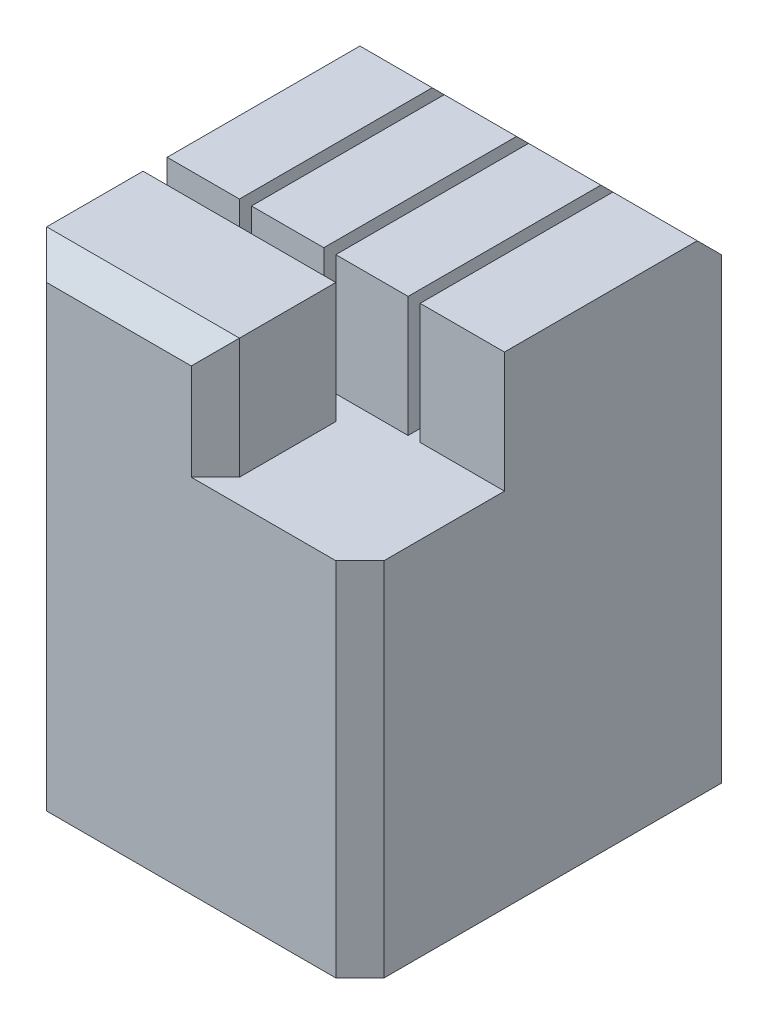
ISO-10303-21;
HEADER;
FILE_DESCRIPTION(('STEP AP214'),'2;1');
FILE_NAME('part.step','',(''),(''),'','','');
FILE_SCHEMA(('AUTOMOTIVE_DESIGN { 1 0 10303 214 1 1 1 1 }'));
ENDSEC;
DATA;
#1=APPLICATION_CONTEXT('core data for automotive mechanical design processes');
#2=APPLICATION_PROTOCOL_DEFINITION('international standard','automotive_design',2000,#1);
#3=PRODUCT_CONTEXT('',#1,'mechanical');
#4=PRODUCT('Part','Part','',(#3));
#5=PRODUCT_RELATED_PRODUCT_CATEGORY('part','',(#4));
#6=PRODUCT_DEFINITION_FORMATION('','',#4);
#7=PRODUCT_DEFINITION_CONTEXT('part definition',#1,'design');
#8=PRODUCT_DEFINITION('design','',#6,#7);
#9=PRODUCT_DEFINITION_SHAPE('','',#8);
#10=(LENGTH_UNIT() NAMED_UNIT(*) SI_UNIT(.MILLI.,.METRE.));
#11=(NAMED_UNIT(*) PLANE_ANGLE_UNIT() SI_UNIT($,.RADIAN.));
#12=(NAMED_UNIT(*) SI_UNIT($,.STERADIAN.) SOLID_ANGLE_UNIT());
#13=UNCERTAINTY_MEASURE_WITH_UNIT(LENGTH_MEASURE(1.E-05),#10,'distance_accuracy_value','');
#14=(GEOMETRIC_REPRESENTATION_CONTEXT(3) GLOBAL_UNCERTAINTY_ASSIGNED_CONTEXT((#13)) GLOBAL_UNIT_ASSIGNED_CONTEXT((#10,
#11,#12)) REPRESENTATION_CONTEXT('',''));
#15=CARTESIAN_POINT('',(0.,0.,0.));
#16=DIRECTION('',(0.,0.,1.));
#17=DIRECTION('',(1.,0.,0.));
#18=AXIS2_PLACEMENT_3D('',#15,#16,#17);
#19=CARTESIAN_POINT('',(14.,-20.,0.));
#20=DIRECTION('',(1.,0.,0.));
#21=DIRECTION('',(0.,0.,-1.));
#22=AXIS2_PLACEMENT_3D('',#19,#20,#21);
#23=PLANE('',#22);
#24=DIRECTION('',(0.,0.,-1.));
#25=VECTOR('',#24,1.);
#26=CARTESIAN_POINT('',(14.,-5.,0.));
#27=LINE('',#26,#25);
#28=CARTESIAN_POINT('',(14.,-5.,-1.));
#29=VERTEX_POINT('',#28);
#30=CARTESIAN_POINT('',(14.,-5.,-6.));
#31=VERTEX_POINT('',#30);
#32=EDGE_CURVE('E272',#29,#31,#27,.T.);
#33=ORIENTED_EDGE('',*,*,#32,.F.);
#34=DIRECTION('',(0.,-1.,0.));
#35=VECTOR('',#34,1.);
#36=CARTESIAN_POINT('',(14.,-20.,-1.));
#37=LINE('',#36,#35);
#38=CARTESIAN_POINT('',(14.,-20.,-1.));
#39=VERTEX_POINT('',#38);
#40=EDGE_CURVE('E439',#29,#39,#37,.T.);
#41=ORIENTED_EDGE('',*,*,#40,.T.);
#42=DIRECTION('',(0.,0.,-1.));
#43=VECTOR('',#42,1.);
#44=CARTESIAN_POINT('',(14.,-20.,0.));
#45=LINE('',#44,#43);
#46=CARTESIAN_POINT('',(14.,-20.,-15.));
#47=VERTEX_POINT('',#46);
#48=EDGE_CURVE('E376',#39,#47,#45,.T.);
#49=ORIENTED_EDGE('',*,*,#48,.T.);
#50=DIRECTION('',(0.,1.,0.));
#51=VECTOR('',#50,1.);
#52=CARTESIAN_POINT('',(14.,-20.,-15.));
#53=LINE('',#52,#51);
#54=CARTESIAN_POINT('',(14.,-1.00000000000001,-15.));
#55=VERTEX_POINT('',#54);
#56=EDGE_CURVE('E436',#47,#55,#53,.T.);
#57=ORIENTED_EDGE('',*,*,#56,.T.);
#58=DIRECTION('',(0.,0.707106781186549,0.707106781186546));
#59=VECTOR('',#58,1.);
#60=CARTESIAN_POINT('',(14.,-3.00000000000005,-17.));
#61=LINE('',#60,#59);
#62=CARTESIAN_POINT('',(14.,0.,-14.));
#63=VERTEX_POINT('',#62);
#64=EDGE_CURVE('E422',#55,#63,#61,.T.);
#65=ORIENTED_EDGE('',*,*,#64,.T.);
#66=DIRECTION('',(0.,0.,-1.));
#67=VECTOR('',#66,1.);
#68=CARTESIAN_POINT('',(14.,0.,0.));
#69=LINE('',#68,#67);
#70=CARTESIAN_POINT('',(14.,0.,-6.));
#71=VERTEX_POINT('',#70);
#72=EDGE_CURVE('E373',#71,#63,#69,.T.);
#73=ORIENTED_EDGE('',*,*,#72,.F.);
#74=DIRECTION('',(0.,1.,0.));
#75=VECTOR('',#74,1.);
#76=CARTESIAN_POINT('',(14.,-5.,-6.));
#77=LINE('',#76,#75);
#78=EDGE_CURVE('E245',#31,#71,#77,.T.);
#79=ORIENTED_EDGE('',*,*,#78,.F.);
#80=EDGE_LOOP('',(#33,#41,#49,#57,#65,#73,#79));
#81=FACE_BOUND('',#80,.T.);
#82=ADVANCED_FACE('F35',(#81),#23,.T.);
#83=CARTESIAN_POINT('',(0.,0.,0.));
#84=DIRECTION('',(0.,-1.,0.));
#85=DIRECTION('',(0.,0.,-1.));
#86=AXIS2_PLACEMENT_3D('',#83,#84,#85);
#87=PLANE('',#86);
#88=DIRECTION('',(0.,0.,1.));
#89=VECTOR('',#88,1.);
#90=CARTESIAN_POINT('',(3.,0.,0.));
#91=LINE('',#90,#89);
#92=CARTESIAN_POINT('',(3.,0.,-14.));
#93=VERTEX_POINT('',#92);
#94=CARTESIAN_POINT('',(3.,0.,-6.));
#95=VERTEX_POINT('',#94);
#96=EDGE_CURVE('E265',#93,#95,#91,.T.);
#97=ORIENTED_EDGE('',*,*,#96,.F.);
#98=DIRECTION('',(-1.,0.,0.));
#99=VECTOR('',#98,1.);
#100=CARTESIAN_POINT('',(0.,0.,-14.));
#101=LINE('',#100,#99);
#102=CARTESIAN_POINT('',(0.,0.,-14.));
#103=VERTEX_POINT('',#102);
#104=EDGE_CURVE('E382',#93,#103,#101,.T.);
#105=ORIENTED_EDGE('',*,*,#104,.T.);
#106=DIRECTION('',(0.,0.,1.));
#107=VECTOR('',#106,1.);
#108=CARTESIAN_POINT('',(0.,0.,0.));
#109=LINE('',#108,#107);
#110=CARTESIAN_POINT('',(0.,0.,-6.));
#111=VERTEX_POINT('',#110);
#112=EDGE_CURVE('E383',#103,#111,#109,.T.);
#113=ORIENTED_EDGE('',*,*,#112,.T.);
#114=DIRECTION('',(1.,0.,0.));
#115=VECTOR('',#114,1.);
#116=CARTESIAN_POINT('',(0.,0.,-6.));
#117=LINE('',#116,#115);
#118=EDGE_CURVE('E262',#111,#95,#117,.T.);
#119=ORIENTED_EDGE('',*,*,#118,.T.);
#120=EDGE_LOOP('',(#97,#105,#113,#119));
#121=FACE_BOUND('',#120,.T.);
#122=ADVANCED_FACE('F512',(#121),#87,.F.);
#123=DIRECTION('',(0.,0.,1.));
#124=VECTOR('',#123,1.);
#125=CARTESIAN_POINT('',(6.5,0.,0.));
#126=LINE('',#125,#124);
#127=CARTESIAN_POINT('',(6.5,0.,-14.));
#128=VERTEX_POINT('',#127);
#129=CARTESIAN_POINT('',(6.5,0.,-6.));
#130=VERTEX_POINT('',#129);
#131=EDGE_CURVE('E319',#128,#130,#126,.T.);
#132=ORIENTED_EDGE('',*,*,#131,.F.);
#133=DIRECTION('',(-1.,0.,0.));
#134=VECTOR('',#133,1.);
#135=CARTESIAN_POINT('',(3.5,0.,-14.));
#136=LINE('',#135,#134);
#137=CARTESIAN_POINT('',(3.5,0.,-14.));
#138=VERTEX_POINT('',#137);
#139=EDGE_CURVE('E403',#128,#138,#136,.T.);
#140=ORIENTED_EDGE('',*,*,#139,.T.);
#141=DIRECTION('',(0.,0.,1.));
#142=VECTOR('',#141,1.);
#143=CARTESIAN_POINT('',(3.5,0.,0.));
#144=LINE('',#143,#142);
#145=CARTESIAN_POINT('',(3.5,0.,-6.));
#146=VERTEX_POINT('',#145);
#147=EDGE_CURVE('E324',#138,#146,#144,.T.);
#148=ORIENTED_EDGE('',*,*,#147,.T.);
#149=DIRECTION('',(1.,0.,0.));
#150=VECTOR('',#149,1.);
#151=CARTESIAN_POINT('',(0.,0.,-6.));
#152=LINE('',#151,#150);
#153=EDGE_CURVE('E321',#146,#130,#152,.T.);
#154=ORIENTED_EDGE('',*,*,#153,.T.);
#155=EDGE_LOOP('',(#132,#140,#148,#154));
#156=FACE_BOUND('',#155,.T.);
#157=ADVANCED_FACE('F517',(#156),#87,.F.);
#158=DIRECTION('',(0.,0.,1.));
#159=VECTOR('',#158,1.);
#160=CARTESIAN_POINT('',(10.,0.,0.));
#161=LINE('',#160,#159);
#162=CARTESIAN_POINT('',(10.,0.,-14.));
#163=VERTEX_POINT('',#162);
#164=CARTESIAN_POINT('',(10.,0.,-6.));
#165=VERTEX_POINT('',#164);
#166=EDGE_CURVE('E312',#163,#165,#161,.T.);
#167=ORIENTED_EDGE('',*,*,#166,.F.);
#168=DIRECTION('',(-1.,0.,0.));
#169=VECTOR('',#168,1.);
#170=CARTESIAN_POINT('',(7.,0.,-14.));
#171=LINE('',#170,#169);
#172=CARTESIAN_POINT('',(7.,0.,-14.));
#173=VERTEX_POINT('',#172);
#174=EDGE_CURVE('E410',#163,#173,#171,.T.);
#175=ORIENTED_EDGE('',*,*,#174,.T.);
#176=DIRECTION('',(0.,0.,1.));
#177=VECTOR('',#176,1.);
#178=CARTESIAN_POINT('',(7.,0.,0.));
#179=LINE('',#178,#177);
#180=CARTESIAN_POINT('',(7.,0.,-6.));
#181=VERTEX_POINT('',#180);
#182=EDGE_CURVE('E317',#173,#181,#179,.T.);
#183=ORIENTED_EDGE('',*,*,#182,.T.);
#184=DIRECTION('',(1.,0.,0.));
#185=VECTOR('',#184,1.);
#186=CARTESIAN_POINT('',(0.,0.,-6.));
#187=LINE('',#186,#185);
#188=EDGE_CURVE('E314',#181,#165,#187,.T.);
#189=ORIENTED_EDGE('',*,*,#188,.T.);
#190=EDGE_LOOP('',(#167,#175,#183,#189));
#191=FACE_BOUND('',#190,.T.);
#192=ADVANCED_FACE('F611',(#191),#87,.F.);
#193=ORIENTED_EDGE('',*,*,#72,.T.);
#194=DIRECTION('',(-1.,0.,0.));
#195=VECTOR('',#194,1.);
#196=CARTESIAN_POINT('',(10.5,0.,-14.));
#197=LINE('',#196,#195);
#198=CARTESIAN_POINT('',(10.5,0.,-14.));
#199=VERTEX_POINT('',#198);
#200=EDGE_CURVE('E417',#63,#199,#197,.T.);
#201=ORIENTED_EDGE('',*,*,#200,.T.);
#202=DIRECTION('',(0.,0.,1.));
#203=VECTOR('',#202,1.);
#204=CARTESIAN_POINT('',(10.5,0.,0.));
#205=LINE('',#204,#203);
#206=CARTESIAN_POINT('',(10.5,0.,-6.));
#207=VERTEX_POINT('',#206);
#208=EDGE_CURVE('E310',#199,#207,#205,.T.);
#209=ORIENTED_EDGE('',*,*,#208,.T.);
#210=DIRECTION('',(1.,0.,0.));
#211=VECTOR('',#210,1.);
#212=CARTESIAN_POINT('',(0.,0.,-6.));
#213=LINE('',#212,#211);
#214=EDGE_CURVE('E307',#207,#71,#213,.T.);
#215=ORIENTED_EDGE('',*,*,#214,.T.);
#216=EDGE_LOOP('',(#193,#201,#209,#215));
#217=FACE_BOUND('',#216,.T.);
#218=ADVANCED_FACE('F528',(#217),#87,.F.);
#219=CARTESIAN_POINT('',(0.,-20.,0.));
#220=DIRECTION('',(-1.,0.,0.));
#221=DIRECTION('',(0.,0.,1.));
#222=AXIS2_PLACEMENT_3D('',#219,#220,#221);
#223=PLANE('',#222);
#224=DIRECTION('',(0.,-0.707106781186549,-0.707106781186546));
#225=VECTOR('',#224,1.);
#226=CARTESIAN_POINT('',(0.,-3.00000000000005,-17.));
#227=LINE('',#226,#225);
#228=CARTESIAN_POINT('',(0.,-1.,-15.));
#229=VERTEX_POINT('',#228);
#230=EDGE_CURVE('E389',#103,#229,#227,.T.);
#231=ORIENTED_EDGE('',*,*,#230,.T.);
#232=DIRECTION('',(0.,-1.,0.));
#233=VECTOR('',#232,1.);
#234=CARTESIAN_POINT('',(0.,-20.,-15.));
#235=LINE('',#234,#233);
#236=CARTESIAN_POINT('',(0.,-20.,-15.));
#237=VERTEX_POINT('',#236);
#238=EDGE_CURVE('E457',#229,#237,#235,.T.);
#239=ORIENTED_EDGE('',*,*,#238,.T.);
#240=DIRECTION('',(0.,0.,1.));
#241=VECTOR('',#240,1.);
#242=CARTESIAN_POINT('',(0.,-20.,0.));
#243=LINE('',#242,#241);
#244=CARTESIAN_POINT('',(0.,-20.,-1.));
#245=VERTEX_POINT('',#244);
#246=EDGE_CURVE('E370',#237,#245,#243,.T.);
#247=ORIENTED_EDGE('',*,*,#246,.T.);
#248=DIRECTION('',(0.,1.,0.));
#249=VECTOR('',#248,1.);
#250=CARTESIAN_POINT('',(0.,-20.,-1.));
#251=LINE('',#250,#249);
#252=CARTESIAN_POINT('',(0.,0.,-1.));
#253=VERTEX_POINT('',#252);
#254=EDGE_CURVE('E60',#245,#253,#251,.T.);
#255=ORIENTED_EDGE('',*,*,#254,.T.);
#256=CARTESIAN_POINT('',(0.,0.,-5.00000000000001));
#257=VERTEX_POINT('',#256);
#258=EDGE_CURVE('E329',#257,#253,#109,.T.);
#259=ORIENTED_EDGE('',*,*,#258,.F.);
#260=DIRECTION('',(0.,1.,0.));
#261=VECTOR('',#260,1.);
#262=CARTESIAN_POINT('',(0.,-5.,-5.00000000000001));
#263=LINE('',#262,#261);
#264=CARTESIAN_POINT('',(0.,-5.,-5.00000000000001));
#265=VERTEX_POINT('',#264);
#266=EDGE_CURVE('E327',#265,#257,#263,.T.);
#267=ORIENTED_EDGE('',*,*,#266,.F.);
#268=DIRECTION('',(0.,0.,1.));
#269=VECTOR('',#268,1.);
#270=CARTESIAN_POINT('',(0.,-5.,0.));
#271=LINE('',#270,#269);
#272=CARTESIAN_POINT('',(0.,-5.,-6.));
#273=VERTEX_POINT('',#272);
#274=EDGE_CURVE('E246',#273,#265,#271,.T.);
#275=ORIENTED_EDGE('',*,*,#274,.F.);
#276=DIRECTION('',(0.,1.,0.));
#277=VECTOR('',#276,1.);
#278=CARTESIAN_POINT('',(0.,-5.,-6.));
#279=LINE('',#278,#277);
#280=EDGE_CURVE('E330',#273,#111,#279,.T.);
#281=ORIENTED_EDGE('',*,*,#280,.T.);
#282=ORIENTED_EDGE('',*,*,#112,.F.);
#283=EDGE_LOOP('',(#231,#239,#247,#255,#259,#267,#275,#281,#282));
#284=FACE_BOUND('',#283,.T.);
#285=ADVANCED_FACE('F525',(#284),#223,.T.);
#286=CARTESIAN_POINT('',(0.,-20.,-16.));
#287=DIRECTION('',(0.,0.,-1.));
#288=DIRECTION('',(-1.,0.,0.));
#289=AXIS2_PLACEMENT_3D('',#286,#287,#288);
#290=PLANE('',#289);
#291=DIRECTION('',(-1.,0.,0.));
#292=VECTOR('',#291,1.);
#293=CARTESIAN_POINT('',(0.,-20.,-16.));
#294=LINE('',#293,#292);
#295=CARTESIAN_POINT('',(13.,-20.,-16.));
#296=VERTEX_POINT('',#295);
#297=CARTESIAN_POINT('',(1.,-20.,-16.));
#298=VERTEX_POINT('',#297);
#299=EDGE_CURVE('E379',#296,#298,#294,.T.);
#300=ORIENTED_EDGE('',*,*,#299,.T.);
#301=DIRECTION('',(0.,1.,0.));
#302=VECTOR('',#301,1.);
#303=CARTESIAN_POINT('',(1.,-20.,-16.));
#304=LINE('',#303,#302);
#305=CARTESIAN_POINT('',(1.,-2.00000000000001,-16.));
#306=VERTEX_POINT('',#305);
#307=EDGE_CURVE('E451',#298,#306,#304,.T.);
#308=ORIENTED_EDGE('',*,*,#307,.T.);
#309=DIRECTION('',(1.,0.,0.));
#310=VECTOR('',#309,1.);
#311=CARTESIAN_POINT('',(3.,-2.00000000000001,-16.));
#312=LINE('',#311,#310);
#313=CARTESIAN_POINT('',(3.,-2.00000000000001,-16.));
#314=VERTEX_POINT('',#313);
#315=EDGE_CURVE('E399',#306,#314,#312,.T.);
#316=ORIENTED_EDGE('',*,*,#315,.T.);
#317=DIRECTION('',(0.,1.,0.));
#318=VECTOR('',#317,1.);
#319=CARTESIAN_POINT('',(3.,-5.,-16.));
#320=LINE('',#319,#318);
#321=CARTESIAN_POINT('',(3.,-5.,-16.));
#322=VERTEX_POINT('',#321);
#323=EDGE_CURVE('E336',#322,#314,#320,.T.);
#324=ORIENTED_EDGE('',*,*,#323,.F.);
#325=DIRECTION('',(-1.,0.,0.));
#326=VECTOR('',#325,1.);
#327=CARTESIAN_POINT('',(0.,-5.,-16.));
#328=LINE('',#327,#326);
#329=CARTESIAN_POINT('',(3.5,-5.,-16.));
#330=VERTEX_POINT('',#329);
#331=EDGE_CURVE('E283',#330,#322,#328,.T.);
#332=ORIENTED_EDGE('',*,*,#331,.F.);
#333=DIRECTION('',(0.,1.,0.));
#334=VECTOR('',#333,1.);
#335=CARTESIAN_POINT('',(3.5,-5.,-16.));
#336=LINE('',#335,#334);
#337=CARTESIAN_POINT('',(3.5,-2.00000000000001,-16.));
#338=VERTEX_POINT('',#337);
#339=EDGE_CURVE('E339',#330,#338,#336,.T.);
#340=ORIENTED_EDGE('',*,*,#339,.T.);
#341=DIRECTION('',(1.,0.,0.));
#342=VECTOR('',#341,1.);
#343=CARTESIAN_POINT('',(6.5,-2.00000000000001,-16.));
#344=LINE('',#343,#342);
#345=CARTESIAN_POINT('',(6.5,-2.00000000000001,-16.));
#346=VERTEX_POINT('',#345);
#347=EDGE_CURVE('E397',#338,#346,#344,.T.);
#348=ORIENTED_EDGE('',*,*,#347,.T.);
#349=DIRECTION('',(0.,1.,0.));
#350=VECTOR('',#349,1.);
#351=CARTESIAN_POINT('',(6.5,-5.,-16.));
#352=LINE('',#351,#350);
#353=CARTESIAN_POINT('',(6.5,-5.,-16.));
#354=VERTEX_POINT('',#353);
#355=EDGE_CURVE('E348',#354,#346,#352,.T.);
#356=ORIENTED_EDGE('',*,*,#355,.F.);
#357=CARTESIAN_POINT('',(7.,-5.,-16.));
#358=VERTEX_POINT('',#357);
#359=EDGE_CURVE('E284',#358,#354,#328,.T.);
#360=ORIENTED_EDGE('',*,*,#359,.F.);
#361=DIRECTION('',(0.,1.,0.));
#362=VECTOR('',#361,1.);
#363=CARTESIAN_POINT('',(7.,-5.,-16.));
#364=LINE('',#363,#362);
#365=CARTESIAN_POINT('',(7.,-2.00000000000001,-16.));
#366=VERTEX_POINT('',#365);
#367=EDGE_CURVE('E351',#358,#366,#364,.T.);
#368=ORIENTED_EDGE('',*,*,#367,.T.);
#369=DIRECTION('',(1.,0.,0.));
#370=VECTOR('',#369,1.);
#371=CARTESIAN_POINT('',(10.,-2.00000000000001,-16.));
#372=LINE('',#371,#370);
#373=CARTESIAN_POINT('',(10.,-2.00000000000001,-16.));
#374=VERTEX_POINT('',#373);
#375=EDGE_CURVE('E395',#366,#374,#372,.T.);
#376=ORIENTED_EDGE('',*,*,#375,.T.);
#377=DIRECTION('',(0.,1.,0.));
#378=VECTOR('',#377,1.);
#379=CARTESIAN_POINT('',(10.,-5.,-16.));
#380=LINE('',#379,#378);
#381=CARTESIAN_POINT('',(10.,-5.,-16.));
#382=VERTEX_POINT('',#381);
#383=EDGE_CURVE('E360',#382,#374,#380,.T.);
#384=ORIENTED_EDGE('',*,*,#383,.F.);
#385=CARTESIAN_POINT('',(10.5,-5.,-16.));
#386=VERTEX_POINT('',#385);
#387=EDGE_CURVE('E279',#386,#382,#328,.T.);
#388=ORIENTED_EDGE('',*,*,#387,.F.);
#389=DIRECTION('',(0.,1.,0.));
#390=VECTOR('',#389,1.);
#391=CARTESIAN_POINT('',(10.5,-5.,-16.));
#392=LINE('',#391,#390);
#393=CARTESIAN_POINT('',(10.5,-2.00000000000001,-16.));
#394=VERTEX_POINT('',#393);
#395=EDGE_CURVE('E363',#386,#394,#392,.T.);
#396=ORIENTED_EDGE('',*,*,#395,.T.);
#397=DIRECTION('',(1.,0.,0.));
#398=VECTOR('',#397,1.);
#399=CARTESIAN_POINT('',(14.,-2.00000000000001,-16.));
#400=LINE('',#399,#398);
#401=CARTESIAN_POINT('',(13.,-2.00000000000001,-16.));
#402=VERTEX_POINT('',#401);
#403=EDGE_CURVE('E392',#394,#402,#400,.T.);
#404=ORIENTED_EDGE('',*,*,#403,.T.);
#405=DIRECTION('',(0.,-1.,0.));
#406=VECTOR('',#405,1.);
#407=CARTESIAN_POINT('',(13.,-20.,-16.));
#408=LINE('',#407,#406);
#409=EDGE_CURVE('E449',#402,#296,#408,.T.);
#410=ORIENTED_EDGE('',*,*,#409,.T.);
#411=EDGE_LOOP('',(#300,#308,#316,#324,#332,#340,#348,#356,#360,#368,#376,#384,#388,#396,#404,#410));
#412=FACE_BOUND('',#411,.T.);
#413=ADVANCED_FACE('F522',(#412),#290,.T.);
#414=CARTESIAN_POINT('',(0.,-20.,0.));
#415=DIRECTION('',(0.,0.,1.));
#416=DIRECTION('',(1.,0.,0.));
#417=AXIS2_PLACEMENT_3D('',#414,#415,#416);
#418=PLANE('',#417);
#419=DIRECTION('',(1.,0.,0.));
#420=VECTOR('',#419,1.);
#421=CARTESIAN_POINT('',(0.,-20.,0.));
#422=LINE('',#421,#420);
#423=CARTESIAN_POINT('',(1.,-20.,0.));
#424=VERTEX_POINT('',#423);
#425=CARTESIAN_POINT('',(13.,-20.,0.));
#426=VERTEX_POINT('',#425);
#427=EDGE_CURVE('E372',#424,#426,#422,.T.);
#428=ORIENTED_EDGE('',*,*,#427,.T.);
#429=DIRECTION('',(0.,1.,0.));
#430=VECTOR('',#429,1.);
#431=CARTESIAN_POINT('',(13.,-20.,0.));
#432=LINE('',#431,#430);
#433=CARTESIAN_POINT('',(13.,-5.,0.));
#434=VERTEX_POINT('',#433);
#435=EDGE_CURVE('E431',#426,#434,#432,.T.);
#436=ORIENTED_EDGE('',*,*,#435,.T.);
#437=DIRECTION('',(1.,0.,0.));
#438=VECTOR('',#437,1.);
#439=CARTESIAN_POINT('',(0.,-5.,0.));
#440=LINE('',#439,#438);
#441=CARTESIAN_POINT('',(7.,-5.,0.));
#442=VERTEX_POINT('',#441);
#443=EDGE_CURVE('E255',#442,#434,#440,.T.);
#444=ORIENTED_EDGE('',*,*,#443,.F.);
#445=DIRECTION('',(0.,1.,0.));
#446=VECTOR('',#445,1.);
#447=CARTESIAN_POINT('',(7.,0.,0.));
#448=LINE('',#447,#446);
#449=CARTESIAN_POINT('',(7.,-1.,0.));
#450=VERTEX_POINT('',#449);
#451=EDGE_CURVE('E428',#442,#450,#448,.T.);
#452=ORIENTED_EDGE('',*,*,#451,.T.);
#453=DIRECTION('',(-1.,0.,0.));
#454=VECTOR('',#453,1.);
#455=CARTESIAN_POINT('',(0.,-1.,0.));
#456=LINE('',#455,#454);
#457=CARTESIAN_POINT('',(1.,-1.,0.));
#458=VERTEX_POINT('',#457);
#459=EDGE_CURVE('E424',#450,#458,#456,.T.);
#460=ORIENTED_EDGE('',*,*,#459,.T.);
#461=DIRECTION('',(0.,-1.,0.));
#462=VECTOR('',#461,1.);
#463=CARTESIAN_POINT('',(1.,-20.,0.));
#464=LINE('',#463,#462);
#465=EDGE_CURVE('E426',#458,#424,#464,.T.);
#466=ORIENTED_EDGE('',*,*,#465,.T.);
#467=EDGE_LOOP('',(#428,#436,#444,#452,#460,#466));
#468=FACE_BOUND('',#467,.T.);
#469=ADVANCED_FACE('F481',(#468),#418,.T.);
#470=CARTESIAN_POINT('',(0.,-20.,0.));
#471=DIRECTION('',(0.,-1.,0.));
#472=DIRECTION('',(0.,0.,-1.));
#473=AXIS2_PLACEMENT_3D('',#470,#471,#472);
#474=PLANE('',#473);
#475=CARTESIAN_POINT('',(7.,-20.,-8.));
#476=DIRECTION('',(0.,-1.,0.));
#477=DIRECTION('',(0.,0.,-1.));
#478=AXIS2_PLACEMENT_3D('',#475,#476,#477);
#479=CIRCLE('',#478,5.);
#480=CARTESIAN_POINT('',(7.,-20.,-13.));
#481=VERTEX_POINT('',#480);
#482=EDGE_CURVE('E268',#481,#481,#479,.T.);
#483=ORIENTED_EDGE('',*,*,#482,.F.);
#484=EDGE_LOOP('',(#483));
#485=FACE_BOUND('',#484,.T.);
#486=ORIENTED_EDGE('',*,*,#48,.F.);
#487=DIRECTION('',(0.707106781186546,0.,-0.707106781186549));
#488=VECTOR('',#487,1.);
#489=CARTESIAN_POINT('',(6.50000000000002,-20.,6.5));
#490=LINE('',#489,#488);
#491=EDGE_CURVE('E447',#39,#426,#490,.F.);
#492=ORIENTED_EDGE('',*,*,#491,.T.);
#493=ORIENTED_EDGE('',*,*,#427,.F.);
#494=DIRECTION('',(0.707106781186549,0.,0.707106781186546));
#495=VECTOR('',#494,1.);
#496=CARTESIAN_POINT('',(0.500000000000001,-20.,-0.500000000000002));
#497=LINE('',#496,#495);
#498=EDGE_CURVE('E441',#424,#245,#497,.F.);
#499=ORIENTED_EDGE('',*,*,#498,.T.);
#500=ORIENTED_EDGE('',*,*,#246,.F.);
#501=DIRECTION('',(-0.707106781186546,0.,0.707106781186549));
#502=VECTOR('',#501,1.);
#503=CARTESIAN_POINT('',(-7.5,-20.,-7.49999999999997));
#504=LINE('',#503,#502);
#505=EDGE_CURVE('E445',#237,#298,#504,.F.);
#506=ORIENTED_EDGE('',*,*,#505,.T.);
#507=ORIENTED_EDGE('',*,*,#299,.F.);
#508=DIRECTION('',(-0.70710678118655,0.,-0.707106781186545));
#509=VECTOR('',#508,1.);
#510=CARTESIAN_POINT('',(14.5,-20.,-14.5000000000001));
#511=LINE('',#510,#509);
#512=EDGE_CURVE('E443',#296,#47,#511,.F.);
#513=ORIENTED_EDGE('',*,*,#512,.T.);
#514=EDGE_LOOP('',(#486,#492,#493,#499,#500,#506,#507,#513));
#515=FACE_BOUND('',#514,.T.);
#516=ADVANCED_FACE('F477',(#485,#515),#474,.T.);
#517=ORIENTED_EDGE('',*,*,#258,.T.);
#518=DIRECTION('',(1.,0.,0.));
#519=VECTOR('',#518,1.);
#520=CARTESIAN_POINT('',(8.,0.,-1.));
#521=LINE('',#520,#519);
#522=CARTESIAN_POINT('',(8.,0.,-1.));
#523=VERTEX_POINT('',#522);
#524=EDGE_CURVE('E45',#253,#523,#521,.T.);
#525=ORIENTED_EDGE('',*,*,#524,.T.);
#526=DIRECTION('',(0.,0.,1.));
#527=VECTOR('',#526,1.);
#528=CARTESIAN_POINT('',(8.,0.,0.));
#529=LINE('',#528,#527);
#530=CARTESIAN_POINT('',(8.,0.,-5.));
#531=VERTEX_POINT('',#530);
#532=EDGE_CURVE('E305',#531,#523,#529,.T.);
#533=ORIENTED_EDGE('',*,*,#532,.F.);
#534=DIRECTION('',(1.,0.,0.));
#535=VECTOR('',#534,1.);
#536=CARTESIAN_POINT('',(0.,0.,-5.00000000000001));
#537=LINE('',#536,#535);
#538=EDGE_CURVE('E243',#257,#531,#537,.T.);
#539=ORIENTED_EDGE('',*,*,#538,.F.);
#540=EDGE_LOOP('',(#517,#525,#533,#539));
#541=FACE_BOUND('',#540,.T.);
#542=ADVANCED_FACE('F480',(#541),#87,.F.);
#543=CARTESIAN_POINT('',(0.,-5.,-5.00000000000001));
#544=DIRECTION('',(0.,0.,1.));
#545=DIRECTION('',(1.,0.,0.));
#546=AXIS2_PLACEMENT_3D('',#543,#544,#545);
#547=PLANE('',#546);
#548=ORIENTED_EDGE('',*,*,#538,.T.);
#549=DIRECTION('',(0.,1.,0.));
#550=VECTOR('',#549,1.);
#551=CARTESIAN_POINT('',(8.,-5.,-5.));
#552=LINE('',#551,#550);
#553=CARTESIAN_POINT('',(8.,-5.,-5.));
#554=VERTEX_POINT('',#553);
#555=EDGE_CURVE('E236',#554,#531,#552,.T.);
#556=ORIENTED_EDGE('',*,*,#555,.F.);
#557=DIRECTION('',(1.,0.,0.));
#558=VECTOR('',#557,1.);
#559=CARTESIAN_POINT('',(0.,-5.,-5.00000000000001));
#560=LINE('',#559,#558);
#561=EDGE_CURVE('E240',#265,#554,#560,.T.);
#562=ORIENTED_EDGE('',*,*,#561,.F.);
#563=ORIENTED_EDGE('',*,*,#266,.T.);
#564=EDGE_LOOP('',(#548,#556,#562,#563));
#565=FACE_BOUND('',#564,.T.);
#566=ADVANCED_FACE('F238',(#565),#547,.F.);
#567=CARTESIAN_POINT('',(0.,-5.,-6.));
#568=DIRECTION('',(0.,0.,1.));
#569=DIRECTION('',(1.,0.,0.));
#570=AXIS2_PLACEMENT_3D('',#567,#568,#569);
#571=PLANE('',#570);
#572=ORIENTED_EDGE('',*,*,#118,.F.);
#573=ORIENTED_EDGE('',*,*,#280,.F.);
#574=DIRECTION('',(1.,0.,0.));
#575=VECTOR('',#574,1.);
#576=CARTESIAN_POINT('',(0.,-5.,-6.));
#577=LINE('',#576,#575);
#578=CARTESIAN_POINT('',(3.,-5.,-6.));
#579=VERTEX_POINT('',#578);
#580=EDGE_CURVE('E301',#273,#579,#577,.T.);
#581=ORIENTED_EDGE('',*,*,#580,.T.);
#582=DIRECTION('',(0.,1.,0.));
#583=VECTOR('',#582,1.);
#584=CARTESIAN_POINT('',(3.,-5.,-6.));
#585=LINE('',#584,#583);
#586=EDGE_CURVE('E333',#579,#95,#585,.T.);
#587=ORIENTED_EDGE('',*,*,#586,.T.);
#588=EDGE_LOOP('',(#572,#573,#581,#587));
#589=FACE_BOUND('',#588,.T.);
#590=ADVANCED_FACE('F639',(#589),#571,.T.);
#591=CARTESIAN_POINT('',(3.,-5.,0.));
#592=DIRECTION('',(-1.,0.,0.));
#593=DIRECTION('',(0.,0.,1.));
#594=AXIS2_PLACEMENT_3D('',#591,#592,#593);
#595=PLANE('',#594);
#596=ORIENTED_EDGE('',*,*,#323,.T.);
#597=DIRECTION('',(0.,0.707106781186549,0.707106781186546));
#598=VECTOR('',#597,1.);
#599=CARTESIAN_POINT('',(3.,0.,-14.));
#600=LINE('',#599,#598);
#601=EDGE_CURVE('E401',#314,#93,#600,.T.);
#602=ORIENTED_EDGE('',*,*,#601,.T.);
#603=ORIENTED_EDGE('',*,*,#96,.T.);
#604=ORIENTED_EDGE('',*,*,#586,.F.);
#605=DIRECTION('',(0.,0.,1.));
#606=VECTOR('',#605,1.);
#607=CARTESIAN_POINT('',(3.,-5.,0.));
#608=LINE('',#607,#606);
#609=EDGE_CURVE('E298',#322,#579,#608,.T.);
#610=ORIENTED_EDGE('',*,*,#609,.F.);
#611=EDGE_LOOP('',(#596,#602,#603,#604,#610));
#612=FACE_BOUND('',#611,.T.);
#613=ADVANCED_FACE('F631',(#612),#595,.F.);
#614=CARTESIAN_POINT('',(3.5,-5.,0.));
#615=DIRECTION('',(-1.,0.,0.));
#616=DIRECTION('',(0.,0.,1.));
#617=AXIS2_PLACEMENT_3D('',#614,#615,#616);
#618=PLANE('',#617);
#619=ORIENTED_EDGE('',*,*,#147,.F.);
#620=DIRECTION('',(0.,-0.707106781186549,-0.707106781186546));
#621=VECTOR('',#620,1.);
#622=CARTESIAN_POINT('',(3.5,4.49999999999999,-9.50000000000004));
#623=LINE('',#622,#621);
#624=EDGE_CURVE('E406',#138,#338,#623,.T.);
#625=ORIENTED_EDGE('',*,*,#624,.T.);
#626=ORIENTED_EDGE('',*,*,#339,.F.);
#627=DIRECTION('',(0.,0.,1.));
#628=VECTOR('',#627,1.);
#629=CARTESIAN_POINT('',(3.5,-5.,0.));
#630=LINE('',#629,#628);
#631=CARTESIAN_POINT('',(3.5,-5.,-6.));
#632=VERTEX_POINT('',#631);
#633=EDGE_CURVE('E296',#330,#632,#630,.T.);
#634=ORIENTED_EDGE('',*,*,#633,.T.);
#635=DIRECTION('',(0.,1.,0.));
#636=VECTOR('',#635,1.);
#637=CARTESIAN_POINT('',(3.5,-5.,-6.));
#638=LINE('',#637,#636);
#639=EDGE_CURVE('E342',#632,#146,#638,.T.);
#640=ORIENTED_EDGE('',*,*,#639,.T.);
#641=EDGE_LOOP('',(#619,#625,#626,#634,#640));
#642=FACE_BOUND('',#641,.T.);
#643=ADVANCED_FACE('F646',(#642),#618,.T.);
#644=CARTESIAN_POINT('',(0.,-5.,-6.));
#645=DIRECTION('',(0.,0.,1.));
#646=DIRECTION('',(1.,0.,0.));
#647=AXIS2_PLACEMENT_3D('',#644,#645,#646);
#648=PLANE('',#647);
#649=ORIENTED_EDGE('',*,*,#153,.F.);
#650=ORIENTED_EDGE('',*,*,#639,.F.);
#651=DIRECTION('',(1.,0.,0.));
#652=VECTOR('',#651,1.);
#653=CARTESIAN_POINT('',(0.,-5.,-6.));
#654=LINE('',#653,#652);
#655=CARTESIAN_POINT('',(6.5,-5.,-6.));
#656=VERTEX_POINT('',#655);
#657=EDGE_CURVE('E294',#632,#656,#654,.T.);
#658=ORIENTED_EDGE('',*,*,#657,.T.);
#659=DIRECTION('',(0.,1.,0.));
#660=VECTOR('',#659,1.);
#661=CARTESIAN_POINT('',(6.5,-5.,-6.));
#662=LINE('',#661,#660);
#663=EDGE_CURVE('E345',#656,#130,#662,.T.);
#664=ORIENTED_EDGE('',*,*,#663,.T.);
#665=EDGE_LOOP('',(#649,#650,#658,#664));
#666=FACE_BOUND('',#665,.T.);
#667=ADVANCED_FACE('F654',(#666),#648,.T.);
#668=CARTESIAN_POINT('',(6.5,-5.,0.));
#669=DIRECTION('',(-1.,0.,0.));
#670=DIRECTION('',(0.,0.,1.));
#671=AXIS2_PLACEMENT_3D('',#668,#669,#670);
#672=PLANE('',#671);
#673=ORIENTED_EDGE('',*,*,#355,.T.);
#674=DIRECTION('',(0.,0.707106781186549,0.707106781186546));
#675=VECTOR('',#674,1.);
#676=CARTESIAN_POINT('',(6.5,0.,-14.));
#677=LINE('',#676,#675);
#678=EDGE_CURVE('E408',#346,#128,#677,.T.);
#679=ORIENTED_EDGE('',*,*,#678,.T.);
#680=ORIENTED_EDGE('',*,*,#131,.T.);
#681=ORIENTED_EDGE('',*,*,#663,.F.);
#682=DIRECTION('',(0.,0.,1.));
#683=VECTOR('',#682,1.);
#684=CARTESIAN_POINT('',(6.5,-5.,0.));
#685=LINE('',#684,#683);
#686=EDGE_CURVE('E291',#354,#656,#685,.T.);
#687=ORIENTED_EDGE('',*,*,#686,.F.);
#688=EDGE_LOOP('',(#673,#679,#680,#681,#687));
#689=FACE_BOUND('',#688,.T.);
#690=ADVANCED_FACE('F658',(#689),#672,.F.);
#691=CARTESIAN_POINT('',(7.,-5.,0.));
#692=DIRECTION('',(-1.,0.,0.));
#693=DIRECTION('',(0.,0.,1.));
#694=AXIS2_PLACEMENT_3D('',#691,#692,#693);
#695=PLANE('',#694);
#696=ORIENTED_EDGE('',*,*,#182,.F.);
#697=DIRECTION('',(0.,-0.707106781186549,-0.707106781186546));
#698=VECTOR('',#697,1.);
#699=CARTESIAN_POINT('',(7.,4.49999999999999,-9.50000000000004));
#700=LINE('',#699,#698);
#701=EDGE_CURVE('E413',#173,#366,#700,.T.);
#702=ORIENTED_EDGE('',*,*,#701,.T.);
#703=ORIENTED_EDGE('',*,*,#367,.F.);
#704=DIRECTION('',(0.,0.,1.));
#705=VECTOR('',#704,1.);
#706=CARTESIAN_POINT('',(7.,-5.,0.));
#707=LINE('',#706,#705);
#708=CARTESIAN_POINT('',(7.,-5.,-6.));
#709=VERTEX_POINT('',#708);
#710=EDGE_CURVE('E289',#358,#709,#707,.T.);
#711=ORIENTED_EDGE('',*,*,#710,.T.);
#712=DIRECTION('',(0.,1.,0.));
#713=VECTOR('',#712,1.);
#714=CARTESIAN_POINT('',(7.,-5.,-6.));
#715=LINE('',#714,#713);
#716=EDGE_CURVE('E354',#709,#181,#715,.T.);
#717=ORIENTED_EDGE('',*,*,#716,.T.);
#718=EDGE_LOOP('',(#696,#702,#703,#711,#717));
#719=FACE_BOUND('',#718,.T.);
#720=ADVANCED_FACE('F613',(#719),#695,.T.);
#721=CARTESIAN_POINT('',(0.,-5.,-6.));
#722=DIRECTION('',(0.,0.,1.));
#723=DIRECTION('',(1.,0.,0.));
#724=AXIS2_PLACEMENT_3D('',#721,#722,#723);
#725=PLANE('',#724);
#726=ORIENTED_EDGE('',*,*,#188,.F.);
#727=ORIENTED_EDGE('',*,*,#716,.F.);
#728=DIRECTION('',(1.,0.,0.));
#729=VECTOR('',#728,1.);
#730=CARTESIAN_POINT('',(0.,-5.,-6.));
#731=LINE('',#730,#729);
#732=CARTESIAN_POINT('',(10.,-5.,-6.));
#733=VERTEX_POINT('',#732);
#734=EDGE_CURVE('E287',#709,#733,#731,.T.);
#735=ORIENTED_EDGE('',*,*,#734,.T.);
#736=DIRECTION('',(0.,1.,0.));
#737=VECTOR('',#736,1.);
#738=CARTESIAN_POINT('',(10.,-5.,-6.));
#739=LINE('',#738,#737);
#740=EDGE_CURVE('E357',#733,#165,#739,.T.);
#741=ORIENTED_EDGE('',*,*,#740,.T.);
#742=EDGE_LOOP('',(#726,#727,#735,#741));
#743=FACE_BOUND('',#742,.T.);
#744=ADVANCED_FACE('F619',(#743),#725,.T.);
#745=CARTESIAN_POINT('',(10.,-5.,0.));
#746=DIRECTION('',(-1.,0.,0.));
#747=DIRECTION('',(0.,0.,1.));
#748=AXIS2_PLACEMENT_3D('',#745,#746,#747);
#749=PLANE('',#748);
#750=ORIENTED_EDGE('',*,*,#383,.T.);
#751=DIRECTION('',(0.,0.707106781186549,0.707106781186546));
#752=VECTOR('',#751,1.);
#753=CARTESIAN_POINT('',(10.,0.,-14.));
#754=LINE('',#753,#752);
#755=EDGE_CURVE('E415',#374,#163,#754,.T.);
#756=ORIENTED_EDGE('',*,*,#755,.T.);
#757=ORIENTED_EDGE('',*,*,#166,.T.);
#758=ORIENTED_EDGE('',*,*,#740,.F.);
#759=DIRECTION('',(0.,0.,1.));
#760=VECTOR('',#759,1.);
#761=CARTESIAN_POINT('',(10.,-5.,0.));
#762=LINE('',#761,#760);
#763=EDGE_CURVE('E282',#382,#733,#762,.T.);
#764=ORIENTED_EDGE('',*,*,#763,.F.);
#765=EDGE_LOOP('',(#750,#756,#757,#758,#764));
#766=FACE_BOUND('',#765,.T.);
#767=ADVANCED_FACE('F605',(#766),#749,.F.);
#768=CARTESIAN_POINT('',(10.5,-5.,0.));
#769=DIRECTION('',(-1.,0.,0.));
#770=DIRECTION('',(0.,0.,1.));
#771=AXIS2_PLACEMENT_3D('',#768,#769,#770);
#772=PLANE('',#771);
#773=ORIENTED_EDGE('',*,*,#208,.F.);
#774=DIRECTION('',(0.,-0.707106781186549,-0.707106781186546));
#775=VECTOR('',#774,1.);
#776=CARTESIAN_POINT('',(10.5,4.49999999999999,-9.50000000000004));
#777=LINE('',#776,#775);
#778=EDGE_CURVE('E420',#199,#394,#777,.T.);
#779=ORIENTED_EDGE('',*,*,#778,.T.);
#780=ORIENTED_EDGE('',*,*,#395,.F.);
#781=DIRECTION('',(0.,0.,1.));
#782=VECTOR('',#781,1.);
#783=CARTESIAN_POINT('',(10.5,-5.,0.));
#784=LINE('',#783,#782);
#785=CARTESIAN_POINT('',(10.5,-5.,-6.));
#786=VERTEX_POINT('',#785);
#787=EDGE_CURVE('E277',#386,#786,#784,.T.);
#788=ORIENTED_EDGE('',*,*,#787,.T.);
#789=DIRECTION('',(0.,1.,0.));
#790=VECTOR('',#789,1.);
#791=CARTESIAN_POINT('',(10.5,-5.,-6.));
#792=LINE('',#791,#790);
#793=EDGE_CURVE('E366',#786,#207,#792,.T.);
#794=ORIENTED_EDGE('',*,*,#793,.T.);
#795=EDGE_LOOP('',(#773,#779,#780,#788,#794));
#796=FACE_BOUND('',#795,.T.);
#797=ADVANCED_FACE('F591',(#796),#772,.T.);
#798=CARTESIAN_POINT('',(0.,-5.,-6.));
#799=DIRECTION('',(0.,0.,1.));
#800=DIRECTION('',(1.,0.,0.));
#801=AXIS2_PLACEMENT_3D('',#798,#799,#800);
#802=PLANE('',#801);
#803=ORIENTED_EDGE('',*,*,#214,.F.);
#804=ORIENTED_EDGE('',*,*,#793,.F.);
#805=DIRECTION('',(1.,0.,0.));
#806=VECTOR('',#805,1.);
#807=CARTESIAN_POINT('',(0.,-5.,-6.));
#808=LINE('',#807,#806);
#809=EDGE_CURVE('E274',#786,#31,#808,.T.);
#810=ORIENTED_EDGE('',*,*,#809,.T.);
#811=ORIENTED_EDGE('',*,*,#78,.T.);
#812=EDGE_LOOP('',(#803,#804,#810,#811));
#813=FACE_BOUND('',#812,.T.);
#814=ADVANCED_FACE('F597',(#813),#802,.T.);
#815=CARTESIAN_POINT('',(8.,-5.,0.));
#816=DIRECTION('',(-1.,0.,0.));
#817=DIRECTION('',(0.,0.,1.));
#818=AXIS2_PLACEMENT_3D('',#815,#816,#817);
#819=PLANE('',#818);
#820=ORIENTED_EDGE('',*,*,#532,.T.);
#821=DIRECTION('',(0.,-1.,0.));
#822=VECTOR('',#821,1.);
#823=CARTESIAN_POINT('',(8.,-5.,-1.));
#824=LINE('',#823,#822);
#825=CARTESIAN_POINT('',(8.,-5.,-1.));
#826=VERTEX_POINT('',#825);
#827=EDGE_CURVE('E252',#523,#826,#824,.T.);
#828=ORIENTED_EDGE('',*,*,#827,.T.);
#829=DIRECTION('',(0.,0.,1.));
#830=VECTOR('',#829,1.);
#831=CARTESIAN_POINT('',(8.,-5.,0.));
#832=LINE('',#831,#830);
#833=EDGE_CURVE('E249',#554,#826,#832,.T.);
#834=ORIENTED_EDGE('',*,*,#833,.F.);
#835=ORIENTED_EDGE('',*,*,#555,.T.);
#836=EDGE_LOOP('',(#820,#828,#834,#835));
#837=FACE_BOUND('',#836,.T.);
#838=ADVANCED_FACE('F250',(#837),#819,.F.);
#839=CARTESIAN_POINT('',(0.,-5.,0.));
#840=DIRECTION('',(0.,1.,0.));
#841=DIRECTION('',(0.,0.,1.));
#842=AXIS2_PLACEMENT_3D('',#839,#840,#841);
#843=PLANE('',#842);
#844=ORIENTED_EDGE('',*,*,#443,.T.);
#845=DIRECTION('',(-0.707106781186546,0.,0.707106781186549));
#846=VECTOR('',#845,1.);
#847=CARTESIAN_POINT('',(6.50000000000002,-5.,6.5));
#848=LINE('',#847,#846);
#849=EDGE_CURVE('E434',#434,#29,#848,.F.);
#850=ORIENTED_EDGE('',*,*,#849,.T.);
#851=ORIENTED_EDGE('',*,*,#32,.T.);
#852=ORIENTED_EDGE('',*,*,#809,.F.);
#853=ORIENTED_EDGE('',*,*,#787,.F.);
#854=ORIENTED_EDGE('',*,*,#387,.T.);
#855=ORIENTED_EDGE('',*,*,#763,.T.);
#856=ORIENTED_EDGE('',*,*,#734,.F.);
#857=ORIENTED_EDGE('',*,*,#710,.F.);
#858=ORIENTED_EDGE('',*,*,#359,.T.);
#859=ORIENTED_EDGE('',*,*,#686,.T.);
#860=ORIENTED_EDGE('',*,*,#657,.F.);
#861=ORIENTED_EDGE('',*,*,#633,.F.);
#862=ORIENTED_EDGE('',*,*,#331,.T.);
#863=ORIENTED_EDGE('',*,*,#609,.T.);
#864=ORIENTED_EDGE('',*,*,#580,.F.);
#865=ORIENTED_EDGE('',*,*,#274,.T.);
#866=ORIENTED_EDGE('',*,*,#561,.T.);
#867=ORIENTED_EDGE('',*,*,#833,.T.);
#868=DIRECTION('',(-0.707106781186549,0.,0.707106781186546));
#869=VECTOR('',#868,1.);
#870=CARTESIAN_POINT('',(7.,-5.,0.));
#871=LINE('',#870,#869);
#872=EDGE_CURVE('E11',#826,#442,#871,.T.);
#873=ORIENTED_EDGE('',*,*,#872,.T.);
#874=EDGE_LOOP('',(#844,#850,#851,#852,#853,#854,#855,#856,#857,#858,#859,#860,#861,#862,#863,
#864,#865,#866,#867,#873));
#875=FACE_BOUND('',#874,.T.);
#876=ADVANCED_FACE('F258',(#875),#843,.T.);
#877=CARTESIAN_POINT('',(0.,0.,-14.));
#878=DIRECTION('',(0.,0.707106781186546,-0.707106781186549));
#879=DIRECTION('',(1.,0.,0.));
#880=AXIS2_PLACEMENT_3D('',#877,#878,#879);
#881=PLANE('',#880);
#882=ORIENTED_EDGE('',*,*,#315,.F.);
#883=DIRECTION('',(0.577350269189624,-0.577350269189629,-0.577350269189626));
#884=VECTOR('',#883,1.);
#885=CARTESIAN_POINT('',(-0.666666666666663,-0.33333333333333,-14.3333333333333));
#886=LINE('',#885,#884);
#887=EDGE_CURVE('E454',#306,#229,#886,.F.);
#888=ORIENTED_EDGE('',*,*,#887,.T.);
#889=ORIENTED_EDGE('',*,*,#230,.F.);
#890=ORIENTED_EDGE('',*,*,#104,.F.);
#891=ORIENTED_EDGE('',*,*,#601,.F.);
#892=EDGE_LOOP('',(#882,#888,#889,#890,#891));
#893=FACE_BOUND('',#892,.T.);
#894=ADVANCED_FACE('F530',(#893),#881,.T.);
#895=CARTESIAN_POINT('',(0.,0.,-14.));
#896=DIRECTION('',(0.,0.707106781186546,-0.707106781186549));
#897=DIRECTION('',(1.,0.,0.));
#898=AXIS2_PLACEMENT_3D('',#895,#896,#897);
#899=PLANE('',#898);
#900=ORIENTED_EDGE('',*,*,#678,.F.);
#901=ORIENTED_EDGE('',*,*,#347,.F.);
#902=ORIENTED_EDGE('',*,*,#624,.F.);
#903=ORIENTED_EDGE('',*,*,#139,.F.);
#904=EDGE_LOOP('',(#900,#901,#902,#903));
#905=FACE_BOUND('',#904,.T.);
#906=ADVANCED_FACE('F536',(#905),#899,.T.);
#907=CARTESIAN_POINT('',(0.,0.,-14.));
#908=DIRECTION('',(0.,0.707106781186546,-0.707106781186549));
#909=DIRECTION('',(1.,0.,0.));
#910=AXIS2_PLACEMENT_3D('',#907,#908,#909);
#911=PLANE('',#910);
#912=ORIENTED_EDGE('',*,*,#755,.F.);
#913=ORIENTED_EDGE('',*,*,#375,.F.);
#914=ORIENTED_EDGE('',*,*,#701,.F.);
#915=ORIENTED_EDGE('',*,*,#174,.F.);
#916=EDGE_LOOP('',(#912,#913,#914,#915));
#917=FACE_BOUND('',#916,.T.);
#918=ADVANCED_FACE('F543',(#917),#911,.T.);
#919=CARTESIAN_POINT('',(0.,0.,-14.));
#920=DIRECTION('',(0.,0.707106781186546,-0.707106781186549));
#921=DIRECTION('',(1.,0.,0.));
#922=AXIS2_PLACEMENT_3D('',#919,#920,#921);
#923=PLANE('',#922);
#924=ORIENTED_EDGE('',*,*,#64,.F.);
#925=DIRECTION('',(0.577350269189627,0.577350269189627,0.577350269189624));
#926=VECTOR('',#925,1.);
#927=CARTESIAN_POINT('',(9.99999999999998,-5.00000000000002,-19.));
#928=LINE('',#927,#926);
#929=EDGE_CURVE('E459',#55,#402,#928,.F.);
#930=ORIENTED_EDGE('',*,*,#929,.T.);
#931=ORIENTED_EDGE('',*,*,#403,.F.);
#932=ORIENTED_EDGE('',*,*,#778,.F.);
#933=ORIENTED_EDGE('',*,*,#200,.F.);
#934=EDGE_LOOP('',(#924,#930,#931,#932,#933));
#935=FACE_BOUND('',#934,.T.);
#936=ADVANCED_FACE('F550',(#935),#923,.T.);
#937=CARTESIAN_POINT('',(13.,-20.,0.));
#938=DIRECTION('',(-0.707106781186549,0.,-0.707106781186546));
#939=DIRECTION('',(0.,1.,0.));
#940=AXIS2_PLACEMENT_3D('',#937,#938,#939);
#941=PLANE('',#940);
#942=ORIENTED_EDGE('',*,*,#491,.F.);
#943=ORIENTED_EDGE('',*,*,#40,.F.);
#944=ORIENTED_EDGE('',*,*,#849,.F.);
#945=ORIENTED_EDGE('',*,*,#435,.F.);
#946=EDGE_LOOP('',(#942,#943,#944,#945));
#947=FACE_BOUND('',#946,.T.);
#948=ADVANCED_FACE('F493',(#947),#941,.F.);
#949=CARTESIAN_POINT('',(1.,-20.,-16.));
#950=DIRECTION('',(0.707106781186549,0.,0.707106781186546));
#951=DIRECTION('',(0.,1.,0.));
#952=AXIS2_PLACEMENT_3D('',#949,#950,#951);
#953=PLANE('',#952);
#954=ORIENTED_EDGE('',*,*,#505,.F.);
#955=ORIENTED_EDGE('',*,*,#238,.F.);
#956=ORIENTED_EDGE('',*,*,#887,.F.);
#957=ORIENTED_EDGE('',*,*,#307,.F.);
#958=EDGE_LOOP('',(#954,#955,#956,#957));
#959=FACE_BOUND('',#958,.T.);
#960=ADVANCED_FACE('F563',(#959),#953,.F.);
#961=CARTESIAN_POINT('',(14.,-20.,-15.));
#962=DIRECTION('',(-0.707106781186545,0.,0.70710678118655));
#963=DIRECTION('',(0.,1.,0.));
#964=AXIS2_PLACEMENT_3D('',#961,#962,#963);
#965=PLANE('',#964);
#966=ORIENTED_EDGE('',*,*,#512,.F.);
#967=ORIENTED_EDGE('',*,*,#409,.F.);
#968=ORIENTED_EDGE('',*,*,#929,.F.);
#969=ORIENTED_EDGE('',*,*,#56,.F.);
#970=EDGE_LOOP('',(#966,#967,#968,#969));
#971=FACE_BOUND('',#970,.T.);
#972=ADVANCED_FACE('F509',(#971),#965,.F.);
#973=CARTESIAN_POINT('',(0.,-20.,-1.));
#974=DIRECTION('',(0.707106781186546,0.,-0.707106781186549));
#975=DIRECTION('',(0.,1.,0.));
#976=AXIS2_PLACEMENT_3D('',#973,#974,#975);
#977=PLANE('',#976);
#978=ORIENTED_EDGE('',*,*,#498,.F.);
#979=ORIENTED_EDGE('',*,*,#465,.F.);
#980=DIRECTION('',(-0.577350269189626,0.577350269189626,-0.577350269189624));
#981=VECTOR('',#980,1.);
#982=CARTESIAN_POINT('',(0.,0.,-1.));
#983=LINE('',#982,#981);
#984=EDGE_CURVE('E40',#253,#458,#983,.F.);
#985=ORIENTED_EDGE('',*,*,#984,.F.);
#986=ORIENTED_EDGE('',*,*,#254,.F.);
#987=EDGE_LOOP('',(#978,#979,#985,#986));
#988=FACE_BOUND('',#987,.T.);
#989=ADVANCED_FACE('F38',(#988),#977,.F.);
#990=CARTESIAN_POINT('',(0.,0.,-1.));
#991=DIRECTION('',(0.,0.707106781186546,0.707106781186549));
#992=DIRECTION('',(-1.,0.,0.));
#993=AXIS2_PLACEMENT_3D('',#990,#991,#992);
#994=PLANE('',#993);
#995=ORIENTED_EDGE('',*,*,#984,.T.);
#996=ORIENTED_EDGE('',*,*,#459,.F.);
#997=DIRECTION('',(0.577350269189626,0.577350269189626,-0.577350269189624));
#998=VECTOR('',#997,1.);
#999=CARTESIAN_POINT('',(5.33333333333333,-2.66666666666667,1.66666666666666));
#1000=LINE('',#999,#998);
#1001=EDGE_CURVE('E462',#523,#450,#1000,.F.);
#1002=ORIENTED_EDGE('',*,*,#1001,.F.);
#1003=ORIENTED_EDGE('',*,*,#524,.F.);
#1004=EDGE_LOOP('',(#995,#996,#1002,#1003));
#1005=FACE_BOUND('',#1004,.T.);
#1006=ADVANCED_FACE('F502',(#1005),#994,.T.);
#1007=CARTESIAN_POINT('',(7.,-20.,0.));
#1008=DIRECTION('',(0.707106781186546,0.,0.707106781186549));
#1009=DIRECTION('',(0.,-1.,0.));
#1010=AXIS2_PLACEMENT_3D('',#1007,#1008,#1009);
#1011=PLANE('',#1010);
#1012=ORIENTED_EDGE('',*,*,#872,.F.);
#1013=ORIENTED_EDGE('',*,*,#827,.F.);
#1014=ORIENTED_EDGE('',*,*,#1001,.T.);
#1015=ORIENTED_EDGE('',*,*,#451,.F.);
#1016=EDGE_LOOP('',(#1012,#1013,#1014,#1015));
#1017=FACE_BOUND('',#1016,.T.);
#1018=ADVANCED_FACE('F496',(#1017),#1011,.T.);
#1019=CARTESIAN_POINT('',(7.,-8.,-8.));
#1020=DIRECTION('',(0.,-1.,0.));
#1021=DIRECTION('',(0.,0.,-1.));
#1022=AXIS2_PLACEMENT_3D('',#1019,#1020,#1021);
#1023=CYLINDRICAL_SURFACE('',#1022,5.);
#1024=CARTESIAN_POINT('',(7.,-8.,-8.));
#1025=DIRECTION('',(0.,-1.,0.));
#1026=DIRECTION('',(0.,0.,-1.));
#1027=AXIS2_PLACEMENT_3D('',#1024,#1025,#1026);
#1028=CIRCLE('',#1027,5.);
#1029=CARTESIAN_POINT('',(7.,-8.,-13.));
#1030=VERTEX_POINT('',#1029);
#1031=EDGE_CURVE('E463',#1030,#1030,#1028,.T.);
#1032=ORIENTED_EDGE('',*,*,#1031,.F.);
#1033=EDGE_LOOP('',(#1032));
#1034=FACE_BOUND('',#1033,.T.);
#1035=ORIENTED_EDGE('',*,*,#482,.T.);
#1036=EDGE_LOOP('',(#1035));
#1037=FACE_BOUND('',#1036,.T.);
#1038=ADVANCED_FACE('F475',(#1034,#1037),#1023,.F.);
#1039=CARTESIAN_POINT('',(7.,-8.,-8.));
#1040=DIRECTION('',(0.,-1.,0.));
#1041=DIRECTION('',(0.,0.,-1.));
#1042=AXIS2_PLACEMENT_3D('',#1039,#1040,#1041);
#1043=PLANE('',#1042);
#1044=ORIENTED_EDGE('',*,*,#1031,.T.);
#1045=EDGE_LOOP('',(#1044));
#1046=FACE_BOUND('',#1045,.T.);
#1047=ADVANCED_FACE('F841',(#1046),#1043,.T.);
#1048=CLOSED_SHELL('',(#82,#122,#157,#192,#218,#285,#413,#469,#516,#542,#566,#590,#613,#643,
#667,#690,#720,#744,#767,#797,#814,#838,#876,#894,#906,#918,#936,#948,#960,#972,#989,#1006,
#1018,#1038,#1047));
#1049=MANIFOLD_SOLID_BREP('B2',#1048);
#1050=ADVANCED_BREP_SHAPE_REPRESENTATION('',(#18,#1049),#14);
#1051=SHAPE_DEFINITION_REPRESENTATION(#9,#1050);
ENDSEC;
END-ISO-10303-21;
